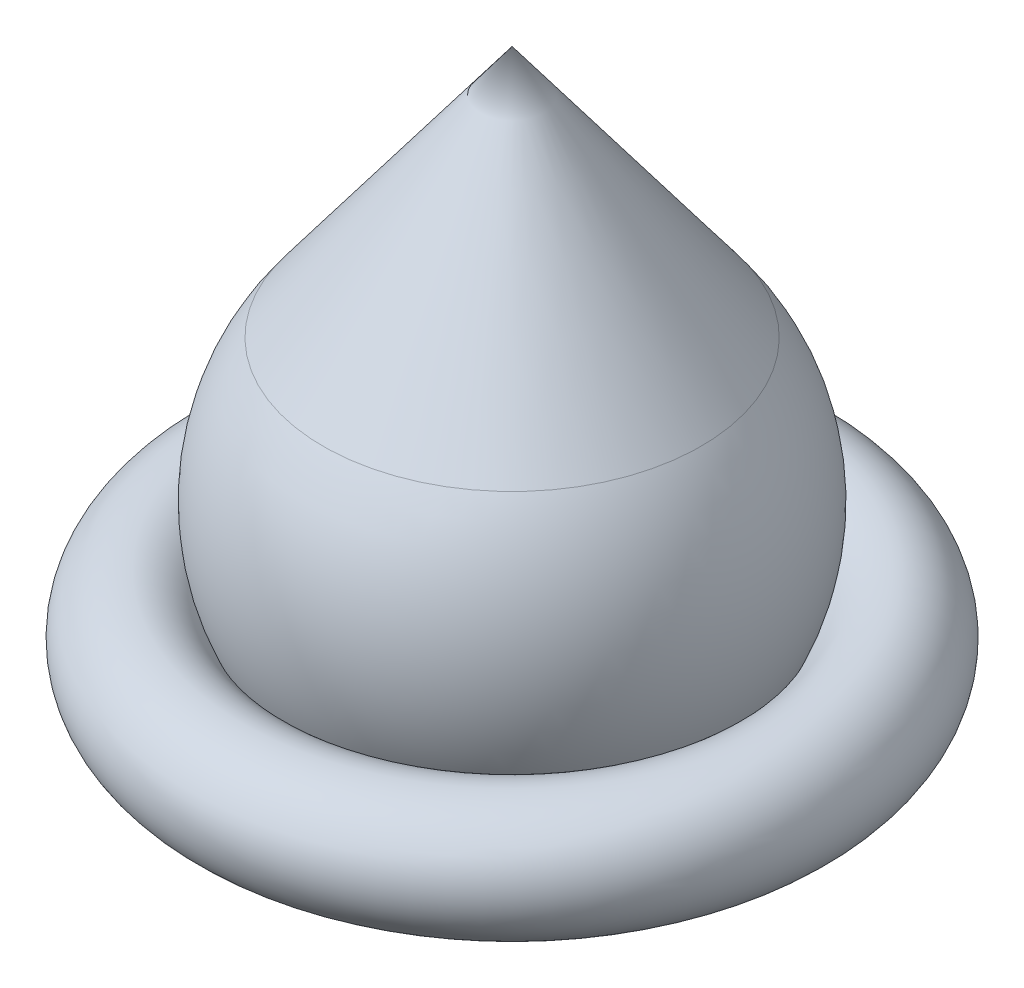
ISO-10303-21;
HEADER;
FILE_DESCRIPTION(('STEP AP214'),'2;1');
FILE_NAME('part.step','',(''),(''),'','','');
FILE_SCHEMA(('AUTOMOTIVE_DESIGN { 1 0 10303 214 1 1 1 1 }'));
ENDSEC;
DATA;
#1=APPLICATION_CONTEXT('core data for automotive mechanical design processes');
#2=APPLICATION_PROTOCOL_DEFINITION('international standard','automotive_design',2000,#1);
#3=PRODUCT_CONTEXT('',#1,'mechanical');
#4=PRODUCT('Part','Part','',(#3));
#5=PRODUCT_RELATED_PRODUCT_CATEGORY('part','',(#4));
#6=PRODUCT_DEFINITION_FORMATION('','',#4);
#7=PRODUCT_DEFINITION_CONTEXT('part definition',#1,'design');
#8=PRODUCT_DEFINITION('design','',#6,#7);
#9=PRODUCT_DEFINITION_SHAPE('','',#8);
#10=(LENGTH_UNIT() NAMED_UNIT(*) SI_UNIT(.MILLI.,.METRE.));
#11=(NAMED_UNIT(*) PLANE_ANGLE_UNIT() SI_UNIT($,.RADIAN.));
#12=(NAMED_UNIT(*) SI_UNIT($,.STERADIAN.) SOLID_ANGLE_UNIT());
#13=UNCERTAINTY_MEASURE_WITH_UNIT(LENGTH_MEASURE(1.E-05),#10,'distance_accuracy_value','');
#14=(GEOMETRIC_REPRESENTATION_CONTEXT(3) GLOBAL_UNCERTAINTY_ASSIGNED_CONTEXT((#13)) GLOBAL_UNIT_ASSIGNED_CONTEXT((#10,
#11,#12)) REPRESENTATION_CONTEXT('',''));
#15=CARTESIAN_POINT('',(0.,0.,0.));
#16=DIRECTION('',(0.,0.,1.));
#17=DIRECTION('',(1.,0.,0.));
#18=AXIS2_PLACEMENT_3D('',#15,#16,#17);
#19=CARTESIAN_POINT('',(0.,9.525,0.));
#20=DIRECTION('',(0.,-1.,0.));
#21=DIRECTION('',(-1.,0.,0.));
#22=AXIS2_PLACEMENT_3D('',#19,#20,#21);
#23=SPHERICAL_SURFACE('',#22,9.525);
#24=CARTESIAN_POINT('',(0.,15.24,0.));
#25=DIRECTION('',(0.,-1.,0.));
#26=DIRECTION('',(0.,0.,-1.));
#27=AXIS2_PLACEMENT_3D('',#24,#25,#26);
#28=CIRCLE('',#27,7.62);
#29=CARTESIAN_POINT('',(0.,15.24,-7.62));
#30=VERTEX_POINT('',#29);
#31=EDGE_CURVE('E12',#30,#30,#28,.T.);
#32=ORIENTED_EDGE('',*,*,#31,.T.);
#33=EDGE_LOOP('',(#32));
#34=FACE_BOUND('',#33,.T.);
#35=ADVANCED_FACE('F49',(#34),#23,.T.);
#36=CARTESIAN_POINT('',(0.,25.4,0.));
#37=DIRECTION('',(0.,-1.,0.));
#38=DIRECTION('',(0.,0.,-1.));
#39=AXIS2_PLACEMENT_3D('',#36,#37,#38);
#40=CONICAL_SURFACE('',#39,0.,0.643501108793285);
#41=ORIENTED_EDGE('',*,*,#31,.F.);
#42=EDGE_LOOP('',(#41));
#43=FACE_BOUND('',#42,.T.);
#44=CARTESIAN_POINT('',(0.,25.4,0.));
#45=VERTEX_POINT('',#44);
#46=VERTEX_LOOP('',#45);
#47=FACE_BOUND('',#46,.T.);
#48=ADVANCED_FACE('F51',(#43,#47),#40,.T.);
#49=CLOSED_SHELL('',(#35,#48));
#50=MANIFOLD_SOLID_BREP('B2',#49);
#51=CARTESIAN_POINT('',(0.,4.76249999999999,0.));
#52=DIRECTION('',(0.,-1.,0.));
#53=DIRECTION('',(0.,0.,-1.));
#54=AXIS2_PLACEMENT_3D('',#51,#52,#53);
#55=TOROIDAL_SURFACE('',#54,10.9122583736136,2.38125);
#56=CARTESIAN_POINT('',(0.,4.76249999999999,-13.2935083736136));
#57=VERTEX_POINT('',#56);
#58=VERTEX_LOOP('',#57);
#59=FACE_BOUND('',#58,.T.);
#60=ADVANCED_FACE('F82',(#59),#55,.T.);
#61=CLOSED_SHELL('',(#60));
#62=MANIFOLD_SOLID_BREP('B6',#61);
#63=ADVANCED_BREP_SHAPE_REPRESENTATION('',(#18,#50,#62),#14);
#64=SHAPE_DEFINITION_REPRESENTATION(#9,#63);
ENDSEC;
END-ISO-10303-21;
